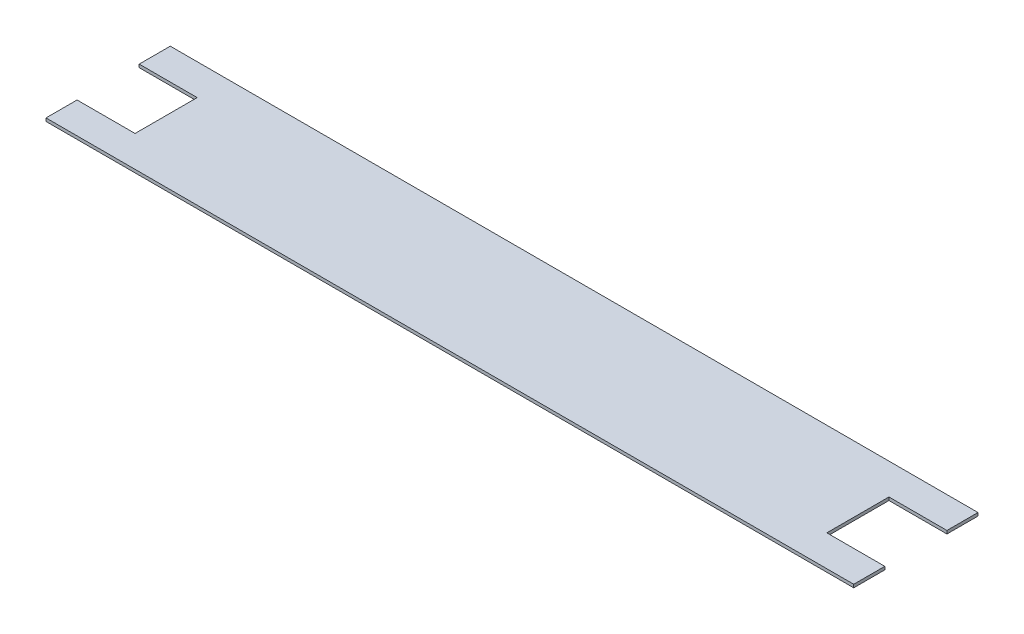
ISO-10303-21;
HEADER;
FILE_DESCRIPTION(('STEP AP214'),'2;1');
FILE_NAME('part.step','',(''),(''),'','','');
FILE_SCHEMA(('AUTOMOTIVE_DESIGN { 1 0 10303 214 1 1 1 1 }'));
ENDSEC;
DATA;
#1=APPLICATION_CONTEXT('core data for automotive mechanical design processes');
#2=APPLICATION_PROTOCOL_DEFINITION('international standard','automotive_design',2000,#1);
#3=PRODUCT_CONTEXT('',#1,'mechanical');
#4=PRODUCT('Part','Part','',(#3));
#5=PRODUCT_RELATED_PRODUCT_CATEGORY('part','',(#4));
#6=PRODUCT_DEFINITION_FORMATION('','',#4);
#7=PRODUCT_DEFINITION_CONTEXT('part definition',#1,'design');
#8=PRODUCT_DEFINITION('design','',#6,#7);
#9=PRODUCT_DEFINITION_SHAPE('','',#8);
#10=(LENGTH_UNIT() NAMED_UNIT(*) SI_UNIT(.MILLI.,.METRE.));
#11=(NAMED_UNIT(*) PLANE_ANGLE_UNIT() SI_UNIT($,.RADIAN.));
#12=(NAMED_UNIT(*) SI_UNIT($,.STERADIAN.) SOLID_ANGLE_UNIT());
#13=UNCERTAINTY_MEASURE_WITH_UNIT(LENGTH_MEASURE(1.E-05),#10,'distance_accuracy_value','');
#14=(GEOMETRIC_REPRESENTATION_CONTEXT(3) GLOBAL_UNCERTAINTY_ASSIGNED_CONTEXT((#13)) GLOBAL_UNIT_ASSIGNED_CONTEXT((#10,
#11,#12)) REPRESENTATION_CONTEXT('',''));
#15=CARTESIAN_POINT('',(0.,0.,0.));
#16=DIRECTION('',(0.,0.,1.));
#17=DIRECTION('',(1.,0.,0.));
#18=AXIS2_PLACEMENT_3D('',#15,#16,#17);
#19=CARTESIAN_POINT('',(390.,1.5,0.));
#20=DIRECTION('',(0.,0.,-1.));
#21=DIRECTION('',(-1.,0.,0.));
#22=AXIS2_PLACEMENT_3D('',#19,#20,#21);
#23=PLANE('',#22);
#24=DIRECTION('',(1.,0.,0.));
#25=VECTOR('',#24,1.);
#26=CARTESIAN_POINT('',(390.,0.,0.));
#27=LINE('',#26,#25);
#28=CARTESIAN_POINT('',(0.,0.,0.));
#29=VERTEX_POINT('',#28);
#30=CARTESIAN_POINT('',(390.,0.,0.));
#31=VERTEX_POINT('',#30);
#32=EDGE_CURVE('E155',#29,#31,#27,.T.);
#33=ORIENTED_EDGE('',*,*,#32,.T.);
#34=DIRECTION('',(0.,-1.,0.));
#35=VECTOR('',#34,1.);
#36=CARTESIAN_POINT('',(390.,1.5,0.));
#37=LINE('',#36,#35);
#38=CARTESIAN_POINT('',(390.,1.5,0.));
#39=VERTEX_POINT('',#38);
#40=EDGE_CURVE('E11',#39,#31,#37,.T.);
#41=ORIENTED_EDGE('',*,*,#40,.F.);
#42=DIRECTION('',(1.,0.,0.));
#43=VECTOR('',#42,1.);
#44=CARTESIAN_POINT('',(390.,1.5,0.));
#45=LINE('',#44,#43);
#46=CARTESIAN_POINT('',(0.,1.5,0.));
#47=VERTEX_POINT('',#46);
#48=EDGE_CURVE('E177',#47,#39,#45,.T.);
#49=ORIENTED_EDGE('',*,*,#48,.F.);
#50=DIRECTION('',(0.,-1.,0.));
#51=VECTOR('',#50,1.);
#52=CARTESIAN_POINT('',(0.,1.5,0.));
#53=LINE('',#52,#51);
#54=EDGE_CURVE('E151',#47,#29,#53,.T.);
#55=ORIENTED_EDGE('',*,*,#54,.T.);
#56=EDGE_LOOP('',(#33,#41,#49,#55));
#57=FACE_BOUND('',#56,.T.);
#58=ADVANCED_FACE('F35',(#57),#23,.F.);
#59=CARTESIAN_POINT('',(390.,1.5,-15.));
#60=DIRECTION('',(-1.,0.,0.));
#61=DIRECTION('',(0.,0.,1.));
#62=AXIS2_PLACEMENT_3D('',#59,#60,#61);
#63=PLANE('',#62);
#64=DIRECTION('',(0.,0.,-1.));
#65=VECTOR('',#64,1.);
#66=CARTESIAN_POINT('',(390.,0.,-15.));
#67=LINE('',#66,#65);
#68=CARTESIAN_POINT('',(390.,0.,-15.));
#69=VERTEX_POINT('',#68);
#70=EDGE_CURVE('E158',#31,#69,#67,.T.);
#71=ORIENTED_EDGE('',*,*,#70,.T.);
#72=DIRECTION('',(0.,-1.,0.));
#73=VECTOR('',#72,1.);
#74=CARTESIAN_POINT('',(390.,1.5,-15.));
#75=LINE('',#74,#73);
#76=CARTESIAN_POINT('',(390.,1.5,-15.));
#77=VERTEX_POINT('',#76);
#78=EDGE_CURVE('E43',#77,#69,#75,.T.);
#79=ORIENTED_EDGE('',*,*,#78,.F.);
#80=DIRECTION('',(0.,0.,-1.));
#81=VECTOR('',#80,1.);
#82=CARTESIAN_POINT('',(390.,1.5,-15.));
#83=LINE('',#82,#81);
#84=EDGE_CURVE('E106',#39,#77,#83,.T.);
#85=ORIENTED_EDGE('',*,*,#84,.F.);
#86=ORIENTED_EDGE('',*,*,#40,.T.);
#87=EDGE_LOOP('',(#71,#79,#85,#86));
#88=FACE_BOUND('',#87,.T.);
#89=ADVANCED_FACE('F255',(#88),#63,.F.);
#90=CARTESIAN_POINT('',(362.,1.5,-15.));
#91=DIRECTION('',(0.,0.,1.));
#92=DIRECTION('',(1.,0.,0.));
#93=AXIS2_PLACEMENT_3D('',#90,#91,#92);
#94=PLANE('',#93);
#95=DIRECTION('',(-1.,0.,0.));
#96=VECTOR('',#95,1.);
#97=CARTESIAN_POINT('',(362.,0.,-15.));
#98=LINE('',#97,#96);
#99=CARTESIAN_POINT('',(362.,0.,-15.));
#100=VERTEX_POINT('',#99);
#101=EDGE_CURVE('E160',#69,#100,#98,.T.);
#102=ORIENTED_EDGE('',*,*,#101,.T.);
#103=DIRECTION('',(0.,-1.,0.));
#104=VECTOR('',#103,1.);
#105=CARTESIAN_POINT('',(362.,1.5,-15.));
#106=LINE('',#105,#104);
#107=CARTESIAN_POINT('',(362.,1.5,-15.));
#108=VERTEX_POINT('',#107);
#109=EDGE_CURVE('E196',#108,#100,#106,.T.);
#110=ORIENTED_EDGE('',*,*,#109,.F.);
#111=DIRECTION('',(-1.,0.,0.));
#112=VECTOR('',#111,1.);
#113=CARTESIAN_POINT('',(362.,1.5,-15.));
#114=LINE('',#113,#112);
#115=EDGE_CURVE('E204',#77,#108,#114,.T.);
#116=ORIENTED_EDGE('',*,*,#115,.F.);
#117=ORIENTED_EDGE('',*,*,#78,.T.);
#118=EDGE_LOOP('',(#102,#110,#116,#117));
#119=FACE_BOUND('',#118,.T.);
#120=ADVANCED_FACE('F202',(#119),#94,.F.);
#121=CARTESIAN_POINT('',(362.,1.5,-45.));
#122=DIRECTION('',(-1.,0.,0.));
#123=DIRECTION('',(0.,0.,1.));
#124=AXIS2_PLACEMENT_3D('',#121,#122,#123);
#125=PLANE('',#124);
#126=DIRECTION('',(0.,0.,-1.));
#127=VECTOR('',#126,1.);
#128=CARTESIAN_POINT('',(362.,0.,-45.));
#129=LINE('',#128,#127);
#130=CARTESIAN_POINT('',(362.,0.,-45.));
#131=VERTEX_POINT('',#130);
#132=EDGE_CURVE('E162',#100,#131,#129,.T.);
#133=ORIENTED_EDGE('',*,*,#132,.T.);
#134=DIRECTION('',(0.,-1.,0.));
#135=VECTOR('',#134,1.);
#136=CARTESIAN_POINT('',(362.,1.5,-45.));
#137=LINE('',#136,#135);
#138=CARTESIAN_POINT('',(362.,1.5,-45.));
#139=VERTEX_POINT('',#138);
#140=EDGE_CURVE('E193',#139,#131,#137,.T.);
#141=ORIENTED_EDGE('',*,*,#140,.F.);
#142=DIRECTION('',(0.,0.,-1.));
#143=VECTOR('',#142,1.);
#144=CARTESIAN_POINT('',(362.,1.5,-45.));
#145=LINE('',#144,#143);
#146=EDGE_CURVE('E222',#108,#139,#145,.T.);
#147=ORIENTED_EDGE('',*,*,#146,.F.);
#148=ORIENTED_EDGE('',*,*,#109,.T.);
#149=EDGE_LOOP('',(#133,#141,#147,#148));
#150=FACE_BOUND('',#149,.T.);
#151=ADVANCED_FACE('F213',(#150),#125,.F.);
#152=CARTESIAN_POINT('',(390.,1.5,-45.));
#153=DIRECTION('',(0.,0.,-1.));
#154=DIRECTION('',(-1.,0.,0.));
#155=AXIS2_PLACEMENT_3D('',#152,#153,#154);
#156=PLANE('',#155);
#157=DIRECTION('',(1.,0.,0.));
#158=VECTOR('',#157,1.);
#159=CARTESIAN_POINT('',(390.,0.,-45.));
#160=LINE('',#159,#158);
#161=CARTESIAN_POINT('',(390.,0.,-45.));
#162=VERTEX_POINT('',#161);
#163=EDGE_CURVE('E164',#131,#162,#160,.T.);
#164=ORIENTED_EDGE('',*,*,#163,.T.);
#165=DIRECTION('',(0.,-1.,0.));
#166=VECTOR('',#165,1.);
#167=CARTESIAN_POINT('',(390.,1.5,-45.));
#168=LINE('',#167,#166);
#169=CARTESIAN_POINT('',(390.,1.5,-45.));
#170=VERTEX_POINT('',#169);
#171=EDGE_CURVE('E190',#170,#162,#168,.T.);
#172=ORIENTED_EDGE('',*,*,#171,.F.);
#173=DIRECTION('',(1.,0.,0.));
#174=VECTOR('',#173,1.);
#175=CARTESIAN_POINT('',(390.,1.5,-45.));
#176=LINE('',#175,#174);
#177=EDGE_CURVE('E219',#139,#170,#176,.T.);
#178=ORIENTED_EDGE('',*,*,#177,.F.);
#179=ORIENTED_EDGE('',*,*,#140,.T.);
#180=EDGE_LOOP('',(#164,#172,#178,#179));
#181=FACE_BOUND('',#180,.T.);
#182=ADVANCED_FACE('F217',(#181),#156,.F.);
#183=CARTESIAN_POINT('',(390.,1.5,-59.9999999999999));
#184=DIRECTION('',(-1.,0.,0.));
#185=DIRECTION('',(0.,0.,1.));
#186=AXIS2_PLACEMENT_3D('',#183,#184,#185);
#187=PLANE('',#186);
#188=DIRECTION('',(0.,0.,-1.));
#189=VECTOR('',#188,1.);
#190=CARTESIAN_POINT('',(390.,0.,-59.9999999999999));
#191=LINE('',#190,#189);
#192=CARTESIAN_POINT('',(390.,0.,-59.9999999999999));
#193=VERTEX_POINT('',#192);
#194=EDGE_CURVE('E166',#162,#193,#191,.T.);
#195=ORIENTED_EDGE('',*,*,#194,.T.);
#196=DIRECTION('',(0.,-1.,0.));
#197=VECTOR('',#196,1.);
#198=CARTESIAN_POINT('',(390.,1.5,-59.9999999999999));
#199=LINE('',#198,#197);
#200=CARTESIAN_POINT('',(390.,1.5,-59.9999999999999));
#201=VERTEX_POINT('',#200);
#202=EDGE_CURVE('E187',#201,#193,#199,.T.);
#203=ORIENTED_EDGE('',*,*,#202,.F.);
#204=DIRECTION('',(0.,0.,-1.));
#205=VECTOR('',#204,1.);
#206=CARTESIAN_POINT('',(390.,1.5,-59.9999999999999));
#207=LINE('',#206,#205);
#208=EDGE_CURVE('E221',#170,#201,#207,.T.);
#209=ORIENTED_EDGE('',*,*,#208,.F.);
#210=ORIENTED_EDGE('',*,*,#171,.T.);
#211=EDGE_LOOP('',(#195,#203,#209,#210));
#212=FACE_BOUND('',#211,.T.);
#213=ADVANCED_FACE('F268',(#212),#187,.F.);
#214=CARTESIAN_POINT('',(0.,1.5,-59.9999999999999));
#215=DIRECTION('',(0.,0.,1.));
#216=DIRECTION('',(1.,0.,0.));
#217=AXIS2_PLACEMENT_3D('',#214,#215,#216);
#218=PLANE('',#217);
#219=DIRECTION('',(-1.,0.,0.));
#220=VECTOR('',#219,1.);
#221=CARTESIAN_POINT('',(0.,0.,-59.9999999999999));
#222=LINE('',#221,#220);
#223=CARTESIAN_POINT('',(0.,0.,-59.9999999999999));
#224=VERTEX_POINT('',#223);
#225=EDGE_CURVE('E168',#193,#224,#222,.T.);
#226=ORIENTED_EDGE('',*,*,#225,.T.);
#227=DIRECTION('',(0.,-1.,0.));
#228=VECTOR('',#227,1.);
#229=CARTESIAN_POINT('',(0.,1.5,-59.9999999999999));
#230=LINE('',#229,#228);
#231=CARTESIAN_POINT('',(0.,1.5,-59.9999999999999));
#232=VERTEX_POINT('',#231);
#233=EDGE_CURVE('E184',#232,#224,#230,.T.);
#234=ORIENTED_EDGE('',*,*,#233,.F.);
#235=DIRECTION('',(-1.,0.,0.));
#236=VECTOR('',#235,1.);
#237=CARTESIAN_POINT('',(0.,1.5,-59.9999999999999));
#238=LINE('',#237,#236);
#239=EDGE_CURVE('E224',#201,#232,#238,.T.);
#240=ORIENTED_EDGE('',*,*,#239,.F.);
#241=ORIENTED_EDGE('',*,*,#202,.T.);
#242=EDGE_LOOP('',(#226,#234,#240,#241));
#243=FACE_BOUND('',#242,.T.);
#244=ADVANCED_FACE('F271',(#243),#218,.F.);
#245=CARTESIAN_POINT('',(0.,1.5,-45.));
#246=DIRECTION('',(1.,0.,0.));
#247=DIRECTION('',(0.,0.,-1.));
#248=AXIS2_PLACEMENT_3D('',#245,#246,#247);
#249=PLANE('',#248);
#250=DIRECTION('',(0.,0.,1.));
#251=VECTOR('',#250,1.);
#252=CARTESIAN_POINT('',(0.,0.,-45.));
#253=LINE('',#252,#251);
#254=CARTESIAN_POINT('',(0.,0.,-45.));
#255=VERTEX_POINT('',#254);
#256=EDGE_CURVE('E170',#224,#255,#253,.T.);
#257=ORIENTED_EDGE('',*,*,#256,.T.);
#258=DIRECTION('',(0.,-1.,0.));
#259=VECTOR('',#258,1.);
#260=CARTESIAN_POINT('',(0.,1.5,-45.));
#261=LINE('',#260,#259);
#262=CARTESIAN_POINT('',(0.,1.5,-45.));
#263=VERTEX_POINT('',#262);
#264=EDGE_CURVE('E181',#263,#255,#261,.T.);
#265=ORIENTED_EDGE('',*,*,#264,.F.);
#266=DIRECTION('',(0.,0.,1.));
#267=VECTOR('',#266,1.);
#268=CARTESIAN_POINT('',(0.,1.5,-45.));
#269=LINE('',#268,#267);
#270=EDGE_CURVE('E230',#232,#263,#269,.T.);
#271=ORIENTED_EDGE('',*,*,#270,.F.);
#272=ORIENTED_EDGE('',*,*,#233,.T.);
#273=EDGE_LOOP('',(#257,#265,#271,#272));
#274=FACE_BOUND('',#273,.T.);
#275=ADVANCED_FACE('F236',(#274),#249,.F.);
#276=CARTESIAN_POINT('',(28.,1.5,-45.));
#277=DIRECTION('',(0.,0.,-1.));
#278=DIRECTION('',(-1.,0.,0.));
#279=AXIS2_PLACEMENT_3D('',#276,#277,#278);
#280=PLANE('',#279);
#281=DIRECTION('',(1.,0.,0.));
#282=VECTOR('',#281,1.);
#283=CARTESIAN_POINT('',(28.,0.,-45.));
#284=LINE('',#283,#282);
#285=CARTESIAN_POINT('',(28.,0.,-45.));
#286=VERTEX_POINT('',#285);
#287=EDGE_CURVE('E172',#255,#286,#284,.T.);
#288=ORIENTED_EDGE('',*,*,#287,.T.);
#289=DIRECTION('',(0.,-1.,0.));
#290=VECTOR('',#289,1.);
#291=CARTESIAN_POINT('',(28.,1.5,-45.));
#292=LINE('',#291,#290);
#293=CARTESIAN_POINT('',(28.,1.5,-45.));
#294=VERTEX_POINT('',#293);
#295=EDGE_CURVE('E146',#294,#286,#292,.T.);
#296=ORIENTED_EDGE('',*,*,#295,.F.);
#297=DIRECTION('',(1.,0.,0.));
#298=VECTOR('',#297,1.);
#299=CARTESIAN_POINT('',(28.,1.5,-45.));
#300=LINE('',#299,#298);
#301=EDGE_CURVE('E137',#263,#294,#300,.T.);
#302=ORIENTED_EDGE('',*,*,#301,.F.);
#303=ORIENTED_EDGE('',*,*,#264,.T.);
#304=EDGE_LOOP('',(#288,#296,#302,#303));
#305=FACE_BOUND('',#304,.T.);
#306=ADVANCED_FACE('F240',(#305),#280,.F.);
#307=CARTESIAN_POINT('',(28.,1.5,-15.));
#308=DIRECTION('',(1.,0.,0.));
#309=DIRECTION('',(0.,0.,-1.));
#310=AXIS2_PLACEMENT_3D('',#307,#308,#309);
#311=PLANE('',#310);
#312=DIRECTION('',(0.,0.,1.));
#313=VECTOR('',#312,1.);
#314=CARTESIAN_POINT('',(28.,0.,-15.));
#315=LINE('',#314,#313);
#316=CARTESIAN_POINT('',(28.,0.,-15.));
#317=VERTEX_POINT('',#316);
#318=EDGE_CURVE('E145',#286,#317,#315,.T.);
#319=ORIENTED_EDGE('',*,*,#318,.T.);
#320=DIRECTION('',(0.,-1.,0.));
#321=VECTOR('',#320,1.);
#322=CARTESIAN_POINT('',(28.,1.5,-15.));
#323=LINE('',#322,#321);
#324=CARTESIAN_POINT('',(28.,1.5,-15.));
#325=VERTEX_POINT('',#324);
#326=EDGE_CURVE('E142',#325,#317,#323,.T.);
#327=ORIENTED_EDGE('',*,*,#326,.F.);
#328=DIRECTION('',(0.,0.,1.));
#329=VECTOR('',#328,1.);
#330=CARTESIAN_POINT('',(28.,1.5,-15.));
#331=LINE('',#330,#329);
#332=EDGE_CURVE('E131',#294,#325,#331,.T.);
#333=ORIENTED_EDGE('',*,*,#332,.F.);
#334=ORIENTED_EDGE('',*,*,#295,.T.);
#335=EDGE_LOOP('',(#319,#327,#333,#334));
#336=FACE_BOUND('',#335,.T.);
#337=ADVANCED_FACE('F143',(#336),#311,.F.);
#338=CARTESIAN_POINT('',(0.,1.5,-15.));
#339=DIRECTION('',(0.,0.,1.));
#340=DIRECTION('',(1.,0.,0.));
#341=AXIS2_PLACEMENT_3D('',#338,#339,#340);
#342=PLANE('',#341);
#343=DIRECTION('',(-1.,0.,0.));
#344=VECTOR('',#343,1.);
#345=CARTESIAN_POINT('',(0.,0.,-15.));
#346=LINE('',#345,#344);
#347=CARTESIAN_POINT('',(0.,0.,-15.));
#348=VERTEX_POINT('',#347);
#349=EDGE_CURVE('E92',#317,#348,#346,.T.);
#350=ORIENTED_EDGE('',*,*,#349,.T.);
#351=DIRECTION('',(0.,-1.,0.));
#352=VECTOR('',#351,1.);
#353=CARTESIAN_POINT('',(0.,1.5,-15.));
#354=LINE('',#353,#352);
#355=CARTESIAN_POINT('',(0.,1.5,-15.));
#356=VERTEX_POINT('',#355);
#357=EDGE_CURVE('E147',#356,#348,#354,.T.);
#358=ORIENTED_EDGE('',*,*,#357,.F.);
#359=DIRECTION('',(-1.,0.,0.));
#360=VECTOR('',#359,1.);
#361=CARTESIAN_POINT('',(0.,1.5,-15.));
#362=LINE('',#361,#360);
#363=EDGE_CURVE('E135',#325,#356,#362,.T.);
#364=ORIENTED_EDGE('',*,*,#363,.F.);
#365=ORIENTED_EDGE('',*,*,#326,.T.);
#366=EDGE_LOOP('',(#350,#358,#364,#365));
#367=FACE_BOUND('',#366,.T.);
#368=ADVANCED_FACE('F149',(#367),#342,.F.);
#369=CARTESIAN_POINT('',(0.,1.5,0.));
#370=DIRECTION('',(1.,0.,0.));
#371=DIRECTION('',(0.,0.,-1.));
#372=AXIS2_PLACEMENT_3D('',#369,#370,#371);
#373=PLANE('',#372);
#374=DIRECTION('',(0.,0.,1.));
#375=VECTOR('',#374,1.);
#376=CARTESIAN_POINT('',(0.,0.,0.));
#377=LINE('',#376,#375);
#378=EDGE_CURVE('E98',#348,#29,#377,.T.);
#379=ORIENTED_EDGE('',*,*,#378,.T.);
#380=ORIENTED_EDGE('',*,*,#54,.F.);
#381=DIRECTION('',(0.,0.,1.));
#382=VECTOR('',#381,1.);
#383=CARTESIAN_POINT('',(0.,1.5,0.));
#384=LINE('',#383,#382);
#385=EDGE_CURVE('E51',#356,#47,#384,.T.);
#386=ORIENTED_EDGE('',*,*,#385,.F.);
#387=ORIENTED_EDGE('',*,*,#357,.T.);
#388=EDGE_LOOP('',(#379,#380,#386,#387));
#389=FACE_BOUND('',#388,.T.);
#390=ADVANCED_FACE('F244',(#389),#373,.F.);
#391=CARTESIAN_POINT('',(0.,1.5,0.));
#392=DIRECTION('',(0.,-1.,0.));
#393=DIRECTION('',(0.,0.,-1.));
#394=AXIS2_PLACEMENT_3D('',#391,#392,#393);
#395=PLANE('',#394);
#396=ORIENTED_EDGE('',*,*,#48,.T.);
#397=ORIENTED_EDGE('',*,*,#84,.T.);
#398=ORIENTED_EDGE('',*,*,#115,.T.);
#399=ORIENTED_EDGE('',*,*,#146,.T.);
#400=ORIENTED_EDGE('',*,*,#177,.T.);
#401=ORIENTED_EDGE('',*,*,#208,.T.);
#402=ORIENTED_EDGE('',*,*,#239,.T.);
#403=ORIENTED_EDGE('',*,*,#270,.T.);
#404=ORIENTED_EDGE('',*,*,#301,.T.);
#405=ORIENTED_EDGE('',*,*,#332,.T.);
#406=ORIENTED_EDGE('',*,*,#363,.T.);
#407=ORIENTED_EDGE('',*,*,#385,.T.);
#408=EDGE_LOOP('',(#396,#397,#398,#399,#400,#401,#402,#403,#404,#405,#406,#407));
#409=FACE_BOUND('',#408,.T.);
#410=ADVANCED_FACE('F133',(#409),#395,.F.);
#411=CARTESIAN_POINT('',(0.,0.,0.));
#412=DIRECTION('',(0.,-1.,0.));
#413=DIRECTION('',(0.,0.,-1.));
#414=AXIS2_PLACEMENT_3D('',#411,#412,#413);
#415=PLANE('',#414);
#416=ORIENTED_EDGE('',*,*,#32,.F.);
#417=ORIENTED_EDGE('',*,*,#378,.F.);
#418=ORIENTED_EDGE('',*,*,#349,.F.);
#419=ORIENTED_EDGE('',*,*,#318,.F.);
#420=ORIENTED_EDGE('',*,*,#287,.F.);
#421=ORIENTED_EDGE('',*,*,#256,.F.);
#422=ORIENTED_EDGE('',*,*,#225,.F.);
#423=ORIENTED_EDGE('',*,*,#194,.F.);
#424=ORIENTED_EDGE('',*,*,#163,.F.);
#425=ORIENTED_EDGE('',*,*,#132,.F.);
#426=ORIENTED_EDGE('',*,*,#101,.F.);
#427=ORIENTED_EDGE('',*,*,#70,.F.);
#428=EDGE_LOOP('',(#416,#417,#418,#419,#420,#421,#422,#423,#424,#425,#426,#427));
#429=FACE_BOUND('',#428,.T.);
#430=ADVANCED_FACE('F208',(#429),#415,.T.);
#431=CLOSED_SHELL('',(#58,#89,#120,#151,#182,#213,#244,#275,#306,#337,#368,#390,#410,#430));
#432=MANIFOLD_SOLID_BREP('B2',#431);
#433=ADVANCED_BREP_SHAPE_REPRESENTATION('',(#18,#432),#14);
#434=SHAPE_DEFINITION_REPRESENTATION(#9,#433);
ENDSEC;
END-ISO-10303-21;
